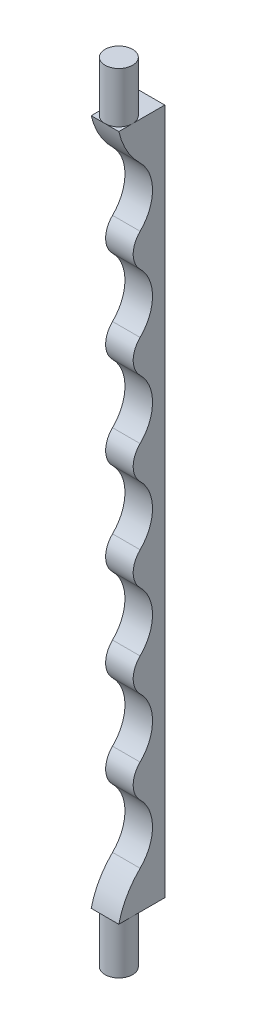
ISO-10303-21;
HEADER;
FILE_DESCRIPTION(('STEP AP214'),'2;1');
FILE_NAME('part.step','',(''),(''),'','','');
FILE_SCHEMA(('AUTOMOTIVE_DESIGN { 1 0 10303 214 1 1 1 1 }'));
ENDSEC;
DATA;
#1=APPLICATION_CONTEXT('core data for automotive mechanical design processes');
#2=APPLICATION_PROTOCOL_DEFINITION('international standard','automotive_design',2000,#1);
#3=PRODUCT_CONTEXT('',#1,'mechanical');
#4=PRODUCT('Part','Part','',(#3));
#5=PRODUCT_RELATED_PRODUCT_CATEGORY('part','',(#4));
#6=PRODUCT_DEFINITION_FORMATION('','',#4);
#7=PRODUCT_DEFINITION_CONTEXT('part definition',#1,'design');
#8=PRODUCT_DEFINITION('design','',#6,#7);
#9=PRODUCT_DEFINITION_SHAPE('','',#8);
#10=(LENGTH_UNIT() NAMED_UNIT(*) SI_UNIT(.MILLI.,.METRE.));
#11=(NAMED_UNIT(*) PLANE_ANGLE_UNIT() SI_UNIT($,.RADIAN.));
#12=(NAMED_UNIT(*) SI_UNIT($,.STERADIAN.) SOLID_ANGLE_UNIT());
#13=UNCERTAINTY_MEASURE_WITH_UNIT(LENGTH_MEASURE(1.E-05),#10,'distance_accuracy_value','');
#14=(GEOMETRIC_REPRESENTATION_CONTEXT(3) GLOBAL_UNCERTAINTY_ASSIGNED_CONTEXT((#13)) GLOBAL_UNIT_ASSIGNED_CONTEXT((#10,
#11,#12)) REPRESENTATION_CONTEXT('',''));
#15=CARTESIAN_POINT('',(0.,0.,0.));
#16=DIRECTION('',(0.,0.,1.));
#17=DIRECTION('',(1.,0.,0.));
#18=AXIS2_PLACEMENT_3D('',#15,#16,#17);
#19=CARTESIAN_POINT('',(9.,112.,-2.49999999999984));
#20=DIRECTION('',(0.,-1.,0.));
#21=DIRECTION('',(0.,0.,-1.));
#22=AXIS2_PLACEMENT_3D('',#19,#20,#21);
#23=PLANE('',#22);
#24=DIRECTION('',(0.,0.,1.));
#25=VECTOR('',#24,1.);
#26=CARTESIAN_POINT('',(9.,112.,-2.49999999999984));
#27=LINE('',#26,#25);
#28=CARTESIAN_POINT('',(9.,112.,-7.0000000000005));
#29=VERTEX_POINT('',#28);
#30=CARTESIAN_POINT('',(9.,112.,-2.49999999999984));
#31=VERTEX_POINT('',#30);
#32=EDGE_CURVE('E192',#29,#31,#27,.T.);
#33=ORIENTED_EDGE('',*,*,#32,.F.);
#34=CARTESIAN_POINT('',(4.5,112.,-7.0000000000005));
#35=DIRECTION('',(0.,-1.,0.));
#36=DIRECTION('',(0.,0.,-1.));
#37=AXIS2_PLACEMENT_3D('',#34,#35,#36);
#38=CIRCLE('',#37,4.5);
#39=CARTESIAN_POINT('',(4.5,112.,-2.5000000000005));
#40=VERTEX_POINT('',#39);
#41=EDGE_CURVE('E49',#29,#40,#38,.T.);
#42=ORIENTED_EDGE('',*,*,#41,.T.);
#43=DIRECTION('',(-1.,0.,0.));
#44=VECTOR('',#43,1.);
#45=CARTESIAN_POINT('',(9.,112.,-2.49999999999984));
#46=LINE('',#45,#44);
#47=EDGE_CURVE('E193',#31,#40,#46,.T.);
#48=ORIENTED_EDGE('',*,*,#47,.F.);
#49=EDGE_LOOP('',(#33,#42,#48));
#50=FACE_BOUND('',#49,.T.);
#51=ADVANCED_FACE('F39',(#50),#23,.F.);
#52=CARTESIAN_POINT('',(0.,112.,-2.49999999999984));
#53=VERTEX_POINT('',#52);
#54=EDGE_CURVE('E198',#40,#53,#46,.T.);
#55=ORIENTED_EDGE('',*,*,#54,.F.);
#56=CARTESIAN_POINT('',(0.,112.,-7.0000000000005));
#57=VERTEX_POINT('',#56);
#58=EDGE_CURVE('E11',#40,#57,#38,.T.);
#59=ORIENTED_EDGE('',*,*,#58,.T.);
#60=DIRECTION('',(0.,0.,1.));
#61=VECTOR('',#60,1.);
#62=CARTESIAN_POINT('',(0.,112.,-2.49999999999984));
#63=LINE('',#62,#61);
#64=EDGE_CURVE('E196',#57,#53,#63,.T.);
#65=ORIENTED_EDGE('',*,*,#64,.T.);
#66=EDGE_LOOP('',(#55,#59,#65));
#67=FACE_BOUND('',#66,.T.);
#68=ADVANCED_FACE('F197',(#67),#23,.F.);
#69=CARTESIAN_POINT('',(9.,-112.,-2.50000000000063));
#70=DIRECTION('',(0.,1.,0.));
#71=DIRECTION('',(0.,0.,1.));
#72=AXIS2_PLACEMENT_3D('',#69,#70,#71);
#73=PLANE('',#72);
#74=CARTESIAN_POINT('',(4.5,-112.,-7.0000000000005));
#75=DIRECTION('',(0.,-1.,0.));
#76=DIRECTION('',(0.,0.,-1.));
#77=AXIS2_PLACEMENT_3D('',#74,#75,#76);
#78=CIRCLE('',#77,4.5);
#79=CARTESIAN_POINT('',(9.,-112.,-7.0000000000005));
#80=VERTEX_POINT('',#79);
#81=CARTESIAN_POINT('',(4.5,-112.,-2.5000000000005));
#82=VERTEX_POINT('',#81);
#83=EDGE_CURVE('E254',#80,#82,#78,.T.);
#84=ORIENTED_EDGE('',*,*,#83,.F.);
#85=DIRECTION('',(0.,0.,-1.));
#86=VECTOR('',#85,1.);
#87=CARTESIAN_POINT('',(9.,-112.,-2.50000000000063));
#88=LINE('',#87,#86);
#89=CARTESIAN_POINT('',(9.,-112.,-2.5000000000005));
#90=VERTEX_POINT('',#89);
#91=EDGE_CURVE('E385',#90,#80,#88,.T.);
#92=ORIENTED_EDGE('',*,*,#91,.F.);
#93=DIRECTION('',(-1.,0.,0.));
#94=VECTOR('',#93,1.);
#95=CARTESIAN_POINT('',(9.,-112.,-2.5000000000005));
#96=LINE('',#95,#94);
#97=EDGE_CURVE('E216',#90,#82,#96,.T.);
#98=ORIENTED_EDGE('',*,*,#97,.T.);
#99=EDGE_LOOP('',(#84,#92,#98));
#100=FACE_BOUND('',#99,.T.);
#101=ADVANCED_FACE('F284',(#100),#73,.F.);
#102=CARTESIAN_POINT('',(0.,-112.,-7.0000000000005));
#103=VERTEX_POINT('',#102);
#104=EDGE_CURVE('E64',#82,#103,#78,.T.);
#105=ORIENTED_EDGE('',*,*,#104,.F.);
#106=CARTESIAN_POINT('',(0.,-112.,-2.5000000000005));
#107=VERTEX_POINT('',#106);
#108=EDGE_CURVE('E214',#82,#107,#96,.T.);
#109=ORIENTED_EDGE('',*,*,#108,.T.);
#110=DIRECTION('',(0.,0.,-1.));
#111=VECTOR('',#110,1.);
#112=CARTESIAN_POINT('',(0.,-112.,-2.50000000000063));
#113=LINE('',#112,#111);
#114=EDGE_CURVE('E372',#107,#103,#113,.T.);
#115=ORIENTED_EDGE('',*,*,#114,.T.);
#116=EDGE_LOOP('',(#105,#109,#115));
#117=FACE_BOUND('',#116,.T.);
#118=ADVANCED_FACE('F427',(#117),#73,.F.);
#119=CARTESIAN_POINT('',(9.,45.,-14.6969384566991));
#120=DIRECTION('',(-1.,0.,0.));
#121=DIRECTION('',(0.,0.,1.));
#122=AXIS2_PLACEMENT_3D('',#119,#120,#121);
#123=CYLINDRICAL_SURFACE('',#122,7.5);
#124=CARTESIAN_POINT('',(0.,45.,-14.6969384566991));
#125=DIRECTION('',(1.,0.,0.));
#126=DIRECTION('',(0.,0.,-1.));
#127=AXIS2_PLACEMENT_3D('',#124,#125,#126);
#128=CIRCLE('',#127,7.5);
#129=CARTESIAN_POINT('',(0.,50.3571428571428,-9.44803186502083));
#130=VERTEX_POINT('',#129);
#131=CARTESIAN_POINT('',(0.,39.6428571428571,-9.44803186502083));
#132=VERTEX_POINT('',#131);
#133=EDGE_CURVE('E263',#130,#132,#128,.T.);
#134=ORIENTED_EDGE('',*,*,#133,.T.);
#135=DIRECTION('',(-1.,0.,0.));
#136=VECTOR('',#135,1.);
#137=CARTESIAN_POINT('',(9.,39.6428571428571,-9.44803186502083));
#138=LINE('',#137,#136);
#139=CARTESIAN_POINT('',(9.,39.6428571428571,-9.44803186502083));
#140=VERTEX_POINT('',#139);
#141=EDGE_CURVE('E43',#140,#132,#138,.T.);
#142=ORIENTED_EDGE('',*,*,#141,.F.);
#143=CARTESIAN_POINT('',(9.,45.,-14.6969384566991));
#144=DIRECTION('',(1.,0.,0.));
#145=DIRECTION('',(0.,0.,-1.));
#146=AXIS2_PLACEMENT_3D('',#143,#144,#145);
#147=CIRCLE('',#146,7.5);
#148=CARTESIAN_POINT('',(9.,50.3571428571428,-9.44803186502083));
#149=VERTEX_POINT('',#148);
#150=EDGE_CURVE('E320',#149,#140,#147,.T.);
#151=ORIENTED_EDGE('',*,*,#150,.F.);
#152=DIRECTION('',(-1.,0.,0.));
#153=VECTOR('',#152,1.);
#154=CARTESIAN_POINT('',(9.,50.3571428571428,-9.44803186502083));
#155=LINE('',#154,#153);
#156=EDGE_CURVE('E318',#149,#130,#155,.T.);
#157=ORIENTED_EDGE('',*,*,#156,.T.);
#158=EDGE_LOOP('',(#134,#142,#151,#157));
#159=FACE_BOUND('',#158,.T.);
#160=ADVANCED_FACE('F41',(#159),#123,.T.);
#161=CARTESIAN_POINT('',(9.,30.,0.));
#162=DIRECTION('',(-1.,0.,0.));
#163=DIRECTION('',(0.,0.,1.));
#164=AXIS2_PLACEMENT_3D('',#161,#162,#163);
#165=CYLINDRICAL_SURFACE('',#164,13.5);
#166=CARTESIAN_POINT('',(0.,30.,0.));
#167=DIRECTION('',(-1.,0.,0.));
#168=DIRECTION('',(0.,0.,-1.));
#169=AXIS2_PLACEMENT_3D('',#166,#167,#168);
#170=CIRCLE('',#169,13.5);
#171=CARTESIAN_POINT('',(0.,20.3571428571429,-9.44803186502082));
#172=VERTEX_POINT('',#171);
#173=EDGE_CURVE('E351',#132,#172,#170,.T.);
#174=ORIENTED_EDGE('',*,*,#173,.T.);
#175=DIRECTION('',(-1.,0.,0.));
#176=VECTOR('',#175,1.);
#177=CARTESIAN_POINT('',(9.,20.3571428571429,-9.44803186502082));
#178=LINE('',#177,#176);
#179=CARTESIAN_POINT('',(9.,20.3571428571429,-9.44803186502082));
#180=VERTEX_POINT('',#179);
#181=EDGE_CURVE('E245',#180,#172,#178,.T.);
#182=ORIENTED_EDGE('',*,*,#181,.F.);
#183=CARTESIAN_POINT('',(9.,30.,0.));
#184=DIRECTION('',(-1.,0.,0.));
#185=DIRECTION('',(0.,0.,-1.));
#186=AXIS2_PLACEMENT_3D('',#183,#184,#185);
#187=CIRCLE('',#186,13.5);
#188=EDGE_CURVE('E613',#140,#180,#187,.T.);
#189=ORIENTED_EDGE('',*,*,#188,.F.);
#190=ORIENTED_EDGE('',*,*,#141,.T.);
#191=EDGE_LOOP('',(#174,#182,#189,#190));
#192=FACE_BOUND('',#191,.T.);
#193=ADVANCED_FACE('F585',(#192),#165,.F.);
#194=CARTESIAN_POINT('',(9.,15.,-14.6969384566991));
#195=DIRECTION('',(-1.,0.,0.));
#196=DIRECTION('',(0.,0.,1.));
#197=AXIS2_PLACEMENT_3D('',#194,#195,#196);
#198=CYLINDRICAL_SURFACE('',#197,7.5);
#199=CARTESIAN_POINT('',(0.,15.,-14.6969384566991));
#200=DIRECTION('',(1.,0.,0.));
#201=DIRECTION('',(0.,0.,-1.));
#202=AXIS2_PLACEMENT_3D('',#199,#200,#201);
#203=CIRCLE('',#202,7.5);
#204=CARTESIAN_POINT('',(0.,9.64285714285714,-9.44803186502083));
#205=VERTEX_POINT('',#204);
#206=EDGE_CURVE('E352',#172,#205,#203,.T.);
#207=ORIENTED_EDGE('',*,*,#206,.T.);
#208=DIRECTION('',(-1.,0.,0.));
#209=VECTOR('',#208,1.);
#210=CARTESIAN_POINT('',(9.,9.64285714285714,-9.44803186502083));
#211=LINE('',#210,#209);
#212=CARTESIAN_POINT('',(9.,9.64285714285714,-9.44803186502083));
#213=VERTEX_POINT('',#212);
#214=EDGE_CURVE('E238',#213,#205,#211,.T.);
#215=ORIENTED_EDGE('',*,*,#214,.F.);
#216=CARTESIAN_POINT('',(9.,15.,-14.6969384566991));
#217=DIRECTION('',(1.,0.,0.));
#218=DIRECTION('',(0.,0.,-1.));
#219=AXIS2_PLACEMENT_3D('',#216,#217,#218);
#220=CIRCLE('',#219,7.5);
#221=EDGE_CURVE('E611',#180,#213,#220,.T.);
#222=ORIENTED_EDGE('',*,*,#221,.F.);
#223=ORIENTED_EDGE('',*,*,#181,.T.);
#224=EDGE_LOOP('',(#207,#215,#222,#223));
#225=FACE_BOUND('',#224,.T.);
#226=ADVANCED_FACE('F572',(#225),#198,.T.);
#227=CARTESIAN_POINT('',(9.,0.,0.));
#228=DIRECTION('',(-1.,0.,0.));
#229=DIRECTION('',(0.,0.,1.));
#230=AXIS2_PLACEMENT_3D('',#227,#228,#229);
#231=CYLINDRICAL_SURFACE('',#230,13.5);
#232=CARTESIAN_POINT('',(0.,0.,0.));
#233=DIRECTION('',(-1.,0.,0.));
#234=DIRECTION('',(0.,0.,-1.));
#235=AXIS2_PLACEMENT_3D('',#232,#233,#234);
#236=CIRCLE('',#235,13.5);
#237=CARTESIAN_POINT('',(0.,-9.64285714285708,-9.44803186502089));
#238=VERTEX_POINT('',#237);
#239=EDGE_CURVE('E359',#205,#238,#236,.T.);
#240=ORIENTED_EDGE('',*,*,#239,.T.);
#241=DIRECTION('',(-1.,0.,0.));
#242=VECTOR('',#241,1.);
#243=CARTESIAN_POINT('',(9.,-9.64285714285708,-9.44803186502089));
#244=LINE('',#243,#242);
#245=CARTESIAN_POINT('',(9.,-9.64285714285708,-9.44803186502089));
#246=VERTEX_POINT('',#245);
#247=EDGE_CURVE('E240',#246,#238,#244,.T.);
#248=ORIENTED_EDGE('',*,*,#247,.F.);
#249=CARTESIAN_POINT('',(9.,0.,0.));
#250=DIRECTION('',(-1.,0.,0.));
#251=DIRECTION('',(0.,0.,-1.));
#252=AXIS2_PLACEMENT_3D('',#249,#250,#251);
#253=CIRCLE('',#252,13.5);
#254=EDGE_CURVE('E612',#213,#246,#253,.T.);
#255=ORIENTED_EDGE('',*,*,#254,.F.);
#256=ORIENTED_EDGE('',*,*,#214,.T.);
#257=EDGE_LOOP('',(#240,#248,#255,#256));
#258=FACE_BOUND('',#257,.T.);
#259=ADVANCED_FACE('F567',(#258),#231,.F.);
#260=CARTESIAN_POINT('',(9.,-14.9999999999999,-14.6969384566992));
#261=DIRECTION('',(-1.,0.,0.));
#262=DIRECTION('',(0.,0.,1.));
#263=AXIS2_PLACEMENT_3D('',#260,#261,#262);
#264=CYLINDRICAL_SURFACE('',#263,7.5);
#265=CARTESIAN_POINT('',(0.,-14.9999999999999,-14.6969384566992));
#266=DIRECTION('',(1.,0.,0.));
#267=DIRECTION('',(0.,0.,-1.));
#268=AXIS2_PLACEMENT_3D('',#265,#266,#267);
#269=CIRCLE('',#268,7.5);
#270=CARTESIAN_POINT('',(0.,-20.3571428571428,-9.44803186502097));
#271=VERTEX_POINT('',#270);
#272=EDGE_CURVE('E360',#238,#271,#269,.T.);
#273=ORIENTED_EDGE('',*,*,#272,.T.);
#274=DIRECTION('',(-1.,0.,0.));
#275=VECTOR('',#274,1.);
#276=CARTESIAN_POINT('',(9.,-20.3571428571428,-9.44803186502097));
#277=LINE('',#276,#275);
#278=CARTESIAN_POINT('',(9.,-20.3571428571428,-9.44803186502097));
#279=VERTEX_POINT('',#278);
#280=EDGE_CURVE('E235',#279,#271,#277,.T.);
#281=ORIENTED_EDGE('',*,*,#280,.F.);
#282=CARTESIAN_POINT('',(9.,-14.9999999999999,-14.6969384566992));
#283=DIRECTION('',(1.,0.,0.));
#284=DIRECTION('',(0.,0.,-1.));
#285=AXIS2_PLACEMENT_3D('',#282,#283,#284);
#286=CIRCLE('',#285,7.5);
#287=EDGE_CURVE('E619',#246,#279,#286,.T.);
#288=ORIENTED_EDGE('',*,*,#287,.F.);
#289=ORIENTED_EDGE('',*,*,#247,.T.);
#290=EDGE_LOOP('',(#273,#281,#288,#289));
#291=FACE_BOUND('',#290,.T.);
#292=ADVANCED_FACE('F560',(#291),#264,.T.);
#293=CARTESIAN_POINT('',(9.,-30.,-2.09488880330588E-13));
#294=DIRECTION('',(-1.,0.,0.));
#295=DIRECTION('',(0.,0.,1.));
#296=AXIS2_PLACEMENT_3D('',#293,#294,#295);
#297=CYLINDRICAL_SURFACE('',#296,13.5);
#298=CARTESIAN_POINT('',(0.,-30.,-2.09488880330588E-13));
#299=DIRECTION('',(-1.,0.,0.));
#300=DIRECTION('',(0.,0.,-1.));
#301=AXIS2_PLACEMENT_3D('',#298,#299,#300);
#302=CIRCLE('',#301,13.5);
#303=CARTESIAN_POINT('',(0.,-39.6428571428571,-9.4480318650211));
#304=VERTEX_POINT('',#303);
#305=EDGE_CURVE('E363',#271,#304,#302,.T.);
#306=ORIENTED_EDGE('',*,*,#305,.T.);
#307=DIRECTION('',(-1.,0.,0.));
#308=VECTOR('',#307,1.);
#309=CARTESIAN_POINT('',(9.,-39.6428571428571,-9.4480318650211));
#310=LINE('',#309,#308);
#311=CARTESIAN_POINT('',(9.,-39.6428571428571,-9.4480318650211));
#312=VERTEX_POINT('',#311);
#313=EDGE_CURVE('E233',#312,#304,#310,.T.);
#314=ORIENTED_EDGE('',*,*,#313,.F.);
#315=CARTESIAN_POINT('',(9.,-30.,-2.09488880330588E-13));
#316=DIRECTION('',(-1.,0.,0.));
#317=DIRECTION('',(0.,0.,-1.));
#318=AXIS2_PLACEMENT_3D('',#315,#316,#317);
#319=CIRCLE('',#318,13.5);
#320=EDGE_CURVE('E625',#279,#312,#319,.T.);
#321=ORIENTED_EDGE('',*,*,#320,.F.);
#322=ORIENTED_EDGE('',*,*,#280,.T.);
#323=EDGE_LOOP('',(#306,#314,#321,#322));
#324=FACE_BOUND('',#323,.T.);
#325=ADVANCED_FACE('F547',(#324),#297,.F.);
#326=CARTESIAN_POINT('',(9.,-44.9999999999999,-14.6969384566994));
#327=DIRECTION('',(-1.,0.,0.));
#328=DIRECTION('',(0.,0.,1.));
#329=AXIS2_PLACEMENT_3D('',#326,#327,#328);
#330=CYLINDRICAL_SURFACE('',#329,7.5);
#331=CARTESIAN_POINT('',(0.,-44.9999999999999,-14.6969384566994));
#332=DIRECTION('',(1.,0.,0.));
#333=DIRECTION('',(0.,0.,-1.));
#334=AXIS2_PLACEMENT_3D('',#331,#332,#333);
#335=CIRCLE('',#334,7.5);
#336=CARTESIAN_POINT('',(0.,-50.3571428571428,-9.44803186502118));
#337=VERTEX_POINT('',#336);
#338=EDGE_CURVE('E361',#304,#337,#335,.T.);
#339=ORIENTED_EDGE('',*,*,#338,.T.);
#340=DIRECTION('',(-1.,0.,0.));
#341=VECTOR('',#340,1.);
#342=CARTESIAN_POINT('',(9.,-50.3571428571428,-9.44803186502118));
#343=LINE('',#342,#341);
#344=CARTESIAN_POINT('',(9.,-50.3571428571428,-9.44803186502118));
#345=VERTEX_POINT('',#344);
#346=EDGE_CURVE('E226',#345,#337,#343,.T.);
#347=ORIENTED_EDGE('',*,*,#346,.F.);
#348=CARTESIAN_POINT('',(9.,-44.9999999999999,-14.6969384566994));
#349=DIRECTION('',(1.,0.,0.));
#350=DIRECTION('',(0.,0.,-1.));
#351=AXIS2_PLACEMENT_3D('',#348,#349,#350);
#352=CIRCLE('',#351,7.5);
#353=EDGE_CURVE('E624',#312,#345,#352,.T.);
#354=ORIENTED_EDGE('',*,*,#353,.F.);
#355=ORIENTED_EDGE('',*,*,#313,.T.);
#356=EDGE_LOOP('',(#339,#347,#354,#355));
#357=FACE_BOUND('',#356,.T.);
#358=ADVANCED_FACE('F537',(#357),#330,.T.);
#359=CARTESIAN_POINT('',(9.,-60.,-4.18977760661176E-13));
#360=DIRECTION('',(-1.,0.,0.));
#361=DIRECTION('',(0.,0.,1.));
#362=AXIS2_PLACEMENT_3D('',#359,#360,#361);
#363=CYLINDRICAL_SURFACE('',#362,13.5);
#364=CARTESIAN_POINT('',(0.,-60.,-4.18977760661176E-13));
#365=DIRECTION('',(-1.,0.,0.));
#366=DIRECTION('',(0.,0.,-1.));
#367=AXIS2_PLACEMENT_3D('',#364,#365,#366);
#368=CIRCLE('',#367,13.5);
#369=CARTESIAN_POINT('',(0.,-69.6428571428571,-9.44803186502131));
#370=VERTEX_POINT('',#369);
#371=EDGE_CURVE('E364',#337,#370,#368,.T.);
#372=ORIENTED_EDGE('',*,*,#371,.T.);
#373=DIRECTION('',(-1.,0.,0.));
#374=VECTOR('',#373,1.);
#375=CARTESIAN_POINT('',(9.,-69.6428571428571,-9.44803186502131));
#376=LINE('',#375,#374);
#377=CARTESIAN_POINT('',(9.,-69.6428571428571,-9.44803186502131));
#378=VERTEX_POINT('',#377);
#379=EDGE_CURVE('E223',#378,#370,#376,.T.);
#380=ORIENTED_EDGE('',*,*,#379,.F.);
#381=CARTESIAN_POINT('',(9.,-60.,-4.18977760661176E-13));
#382=DIRECTION('',(-1.,0.,0.));
#383=DIRECTION('',(0.,0.,-1.));
#384=AXIS2_PLACEMENT_3D('',#381,#382,#383);
#385=CIRCLE('',#384,13.5);
#386=EDGE_CURVE('E628',#345,#378,#385,.T.);
#387=ORIENTED_EDGE('',*,*,#386,.F.);
#388=ORIENTED_EDGE('',*,*,#346,.T.);
#389=EDGE_LOOP('',(#372,#380,#387,#388));
#390=FACE_BOUND('',#389,.T.);
#391=ADVANCED_FACE('F529',(#390),#363,.F.);
#392=CARTESIAN_POINT('',(9.,-74.9999999999999,-14.6969384566996));
#393=DIRECTION('',(-1.,0.,0.));
#394=DIRECTION('',(0.,0.,1.));
#395=AXIS2_PLACEMENT_3D('',#392,#393,#394);
#396=CYLINDRICAL_SURFACE('',#395,7.49999999999996);
#397=CARTESIAN_POINT('',(0.,-74.9999999999999,-14.6969384566996));
#398=DIRECTION('',(1.,0.,0.));
#399=DIRECTION('',(0.,0.,-1.));
#400=AXIS2_PLACEMENT_3D('',#397,#398,#399);
#401=CIRCLE('',#400,7.49999999999996);
#402=CARTESIAN_POINT('',(0.,-80.3571428571426,-9.44803186502128));
#403=VERTEX_POINT('',#402);
#404=EDGE_CURVE('E370',#370,#403,#401,.T.);
#405=ORIENTED_EDGE('',*,*,#404,.T.);
#406=DIRECTION('',(-1.,0.,0.));
#407=VECTOR('',#406,1.);
#408=CARTESIAN_POINT('',(9.,-80.3571428571426,-9.44803186502128));
#409=LINE('',#408,#407);
#410=CARTESIAN_POINT('',(9.,-80.3571428571426,-9.44803186502128));
#411=VERTEX_POINT('',#410);
#412=EDGE_CURVE('E225',#411,#403,#409,.T.);
#413=ORIENTED_EDGE('',*,*,#412,.F.);
#414=CARTESIAN_POINT('',(9.,-74.9999999999999,-14.6969384566996));
#415=DIRECTION('',(1.,0.,0.));
#416=DIRECTION('',(0.,0.,-1.));
#417=AXIS2_PLACEMENT_3D('',#414,#415,#416);
#418=CIRCLE('',#417,7.49999999999996);
#419=EDGE_CURVE('E626',#378,#411,#418,.T.);
#420=ORIENTED_EDGE('',*,*,#419,.F.);
#421=ORIENTED_EDGE('',*,*,#379,.T.);
#422=EDGE_LOOP('',(#405,#413,#420,#421));
#423=FACE_BOUND('',#422,.T.);
#424=ADVANCED_FACE('F523',(#423),#396,.T.);
#425=CARTESIAN_POINT('',(9.,-89.9999999999998,-4.85806818960967E-13));
#426=DIRECTION('',(-1.,0.,0.));
#427=DIRECTION('',(0.,0.,1.));
#428=AXIS2_PLACEMENT_3D('',#425,#426,#427);
#429=CYLINDRICAL_SURFACE('',#428,13.5);
#430=CARTESIAN_POINT('',(0.,-89.9999999999998,-4.85806818960967E-13));
#431=DIRECTION('',(-1.,0.,0.));
#432=DIRECTION('',(0.,0.,-1.));
#433=AXIS2_PLACEMENT_3D('',#430,#431,#432);
#434=CIRCLE('',#433,13.5);
#435=CARTESIAN_POINT('',(0.,-99.6428571428569,-9.44803186502131));
#436=VERTEX_POINT('',#435);
#437=EDGE_CURVE('E369',#403,#436,#434,.T.);
#438=ORIENTED_EDGE('',*,*,#437,.T.);
#439=DIRECTION('',(-1.,0.,0.));
#440=VECTOR('',#439,1.);
#441=CARTESIAN_POINT('',(9.,-99.6428571428569,-9.44803186502131));
#442=LINE('',#441,#440);
#443=CARTESIAN_POINT('',(9.,-99.6428571428569,-9.44803186502131));
#444=VERTEX_POINT('',#443);
#445=EDGE_CURVE('E218',#444,#436,#442,.T.);
#446=ORIENTED_EDGE('',*,*,#445,.F.);
#447=CARTESIAN_POINT('',(9.,-89.9999999999998,-4.85806818960967E-13));
#448=DIRECTION('',(-1.,0.,0.));
#449=DIRECTION('',(0.,0.,-1.));
#450=AXIS2_PLACEMENT_3D('',#447,#448,#449);
#451=CIRCLE('',#450,13.5);
#452=EDGE_CURVE('E627',#411,#444,#451,.T.);
#453=ORIENTED_EDGE('',*,*,#452,.F.);
#454=ORIENTED_EDGE('',*,*,#412,.T.);
#455=EDGE_LOOP('',(#438,#446,#453,#454));
#456=FACE_BOUND('',#455,.T.);
#457=ADVANCED_FACE('F448',(#456),#429,.F.);
#458=CARTESIAN_POINT('',(9.,-117.750299061326,-27.1896291639541));
#459=DIRECTION('',(-1.,0.,0.));
#460=DIRECTION('',(0.,0.,1.));
#461=AXIS2_PLACEMENT_3D('',#458,#459,#460);
#462=CYLINDRICAL_SURFACE('',#461,25.3504186858569);
#463=CARTESIAN_POINT('',(0.,-117.750299061326,-27.1896291639541));
#464=DIRECTION('',(1.,0.,0.));
#465=DIRECTION('',(0.,0.,-1.));
#466=AXIS2_PLACEMENT_3D('',#463,#464,#465);
#467=CIRCLE('',#466,25.3504186858569);
#468=EDGE_CURVE('E371',#436,#107,#467,.T.);
#469=ORIENTED_EDGE('',*,*,#468,.T.);
#470=ORIENTED_EDGE('',*,*,#108,.F.);
#471=ORIENTED_EDGE('',*,*,#97,.F.);
#472=CARTESIAN_POINT('',(9.,-117.750299061326,-27.1896291639541));
#473=DIRECTION('',(1.,0.,0.));
#474=DIRECTION('',(0.,0.,-1.));
#475=AXIS2_PLACEMENT_3D('',#472,#473,#474);
#476=CIRCLE('',#475,25.3504186858569);
#477=EDGE_CURVE('E633',#444,#90,#476,.T.);
#478=ORIENTED_EDGE('',*,*,#477,.F.);
#479=ORIENTED_EDGE('',*,*,#445,.T.);
#480=EDGE_LOOP('',(#469,#470,#471,#478,#479));
#481=FACE_BOUND('',#480,.T.);
#482=ADVANCED_FACE('F445',(#481),#462,.T.);
#483=EDGE_CURVE('E250',#103,#80,#78,.T.);
#484=ORIENTED_EDGE('',*,*,#483,.F.);
#485=CARTESIAN_POINT('',(0.,-112.,-17.4999999999997));
#486=VERTEX_POINT('',#485);
#487=EDGE_CURVE('E373',#103,#486,#113,.T.);
#488=ORIENTED_EDGE('',*,*,#487,.T.);
#489=DIRECTION('',(-1.,0.,0.));
#490=VECTOR('',#489,1.);
#491=CARTESIAN_POINT('',(9.,-112.,-17.4999999999997));
#492=LINE('',#491,#490);
#493=CARTESIAN_POINT('',(9.,-112.,-17.4999999999997));
#494=VERTEX_POINT('',#493);
#495=EDGE_CURVE('E208',#494,#486,#492,.T.);
#496=ORIENTED_EDGE('',*,*,#495,.F.);
#497=EDGE_CURVE('E387',#80,#494,#88,.T.);
#498=ORIENTED_EDGE('',*,*,#497,.F.);
#499=EDGE_LOOP('',(#484,#488,#496,#498));
#500=FACE_BOUND('',#499,.T.);
#501=ADVANCED_FACE('F293',(#500),#73,.F.);
#502=CARTESIAN_POINT('',(9.,-112.,-17.4999999999997));
#503=DIRECTION('',(0.,0.,1.));
#504=DIRECTION('',(1.,0.,0.));
#505=AXIS2_PLACEMENT_3D('',#502,#503,#504);
#506=PLANE('',#505);
#507=DIRECTION('',(0.,1.,0.));
#508=VECTOR('',#507,1.);
#509=CARTESIAN_POINT('',(0.,-112.,-17.4999999999997));
#510=LINE('',#509,#508);
#511=CARTESIAN_POINT('',(0.,112.,-17.4999999999997));
#512=VERTEX_POINT('',#511);
#513=EDGE_CURVE('E306',#486,#512,#510,.T.);
#514=ORIENTED_EDGE('',*,*,#513,.T.);
#515=DIRECTION('',(-1.,0.,0.));
#516=VECTOR('',#515,1.);
#517=CARTESIAN_POINT('',(9.,112.,-17.4999999999997));
#518=LINE('',#517,#516);
#519=CARTESIAN_POINT('',(9.,112.,-17.4999999999997));
#520=VERTEX_POINT('',#519);
#521=EDGE_CURVE('E206',#520,#512,#518,.T.);
#522=ORIENTED_EDGE('',*,*,#521,.F.);
#523=DIRECTION('',(0.,1.,0.));
#524=VECTOR('',#523,1.);
#525=CARTESIAN_POINT('',(9.,-112.,-17.4999999999997));
#526=LINE('',#525,#524);
#527=EDGE_CURVE('E381',#494,#520,#526,.T.);
#528=ORIENTED_EDGE('',*,*,#527,.F.);
#529=ORIENTED_EDGE('',*,*,#495,.T.);
#530=EDGE_LOOP('',(#514,#522,#528,#529));
#531=FACE_BOUND('',#530,.T.);
#532=ADVANCED_FACE('F287',(#531),#506,.F.);
#533=EDGE_CURVE('E299',#512,#57,#63,.T.);
#534=ORIENTED_EDGE('',*,*,#533,.T.);
#535=EDGE_CURVE('E48',#57,#29,#38,.T.);
#536=ORIENTED_EDGE('',*,*,#535,.T.);
#537=EDGE_CURVE('E383',#520,#29,#27,.T.);
#538=ORIENTED_EDGE('',*,*,#537,.F.);
#539=ORIENTED_EDGE('',*,*,#521,.T.);
#540=EDGE_LOOP('',(#534,#536,#538,#539));
#541=FACE_BOUND('',#540,.T.);
#542=ADVANCED_FACE('F276',(#541),#23,.F.);
#543=CARTESIAN_POINT('',(9.,117.750299061328,-27.1896291639552));
#544=DIRECTION('',(-1.,0.,0.));
#545=DIRECTION('',(0.,0.,1.));
#546=AXIS2_PLACEMENT_3D('',#543,#544,#545);
#547=CYLINDRICAL_SURFACE('',#546,25.3504186858589);
#548=CARTESIAN_POINT('',(0.,117.750299061328,-27.1896291639552));
#549=DIRECTION('',(1.,0.,0.));
#550=DIRECTION('',(0.,0.,1.));
#551=AXIS2_PLACEMENT_3D('',#548,#549,#550);
#552=CIRCLE('',#551,25.3504186858589);
#553=CARTESIAN_POINT('',(0.,99.6428571428571,-9.44803186502083));
#554=VERTEX_POINT('',#553);
#555=EDGE_CURVE('E305',#53,#554,#552,.T.);
#556=ORIENTED_EDGE('',*,*,#555,.T.);
#557=DIRECTION('',(-1.,0.,0.));
#558=VECTOR('',#557,1.);
#559=CARTESIAN_POINT('',(9.,99.6428571428571,-9.44803186502083));
#560=LINE('',#559,#558);
#561=CARTESIAN_POINT('',(9.,99.6428571428571,-9.44803186502083));
#562=VERTEX_POINT('',#561);
#563=EDGE_CURVE('E203',#562,#554,#560,.T.);
#564=ORIENTED_EDGE('',*,*,#563,.F.);
#565=CARTESIAN_POINT('',(9.,117.750299061328,-27.1896291639552));
#566=DIRECTION('',(1.,0.,0.));
#567=DIRECTION('',(0.,0.,1.));
#568=AXIS2_PLACEMENT_3D('',#565,#566,#567);
#569=CIRCLE('',#568,25.3504186858589);
#570=EDGE_CURVE('E202',#31,#562,#569,.T.);
#571=ORIENTED_EDGE('',*,*,#570,.F.);
#572=ORIENTED_EDGE('',*,*,#47,.T.);
#573=ORIENTED_EDGE('',*,*,#54,.T.);
#574=EDGE_LOOP('',(#556,#564,#571,#572,#573));
#575=FACE_BOUND('',#574,.T.);
#576=ADVANCED_FACE('F201',(#575),#547,.T.);
#577=CARTESIAN_POINT('',(9.,90.,0.));
#578=DIRECTION('',(-1.,0.,0.));
#579=DIRECTION('',(0.,0.,1.));
#580=AXIS2_PLACEMENT_3D('',#577,#578,#579);
#581=CYLINDRICAL_SURFACE('',#580,13.5);
#582=CARTESIAN_POINT('',(0.,90.,0.));
#583=DIRECTION('',(-1.,0.,0.));
#584=DIRECTION('',(0.,0.,-1.));
#585=AXIS2_PLACEMENT_3D('',#582,#583,#584);
#586=CIRCLE('',#585,13.5);
#587=CARTESIAN_POINT('',(0.,80.3571428571428,-9.44803186502083));
#588=VERTEX_POINT('',#587);
#589=EDGE_CURVE('E308',#554,#588,#586,.T.);
#590=ORIENTED_EDGE('',*,*,#589,.T.);
#591=DIRECTION('',(-1.,0.,0.));
#592=VECTOR('',#591,1.);
#593=CARTESIAN_POINT('',(9.,80.3571428571428,-9.44803186502083));
#594=LINE('',#593,#592);
#595=CARTESIAN_POINT('',(9.,80.3571428571428,-9.44803186502083));
#596=VERTEX_POINT('',#595);
#597=EDGE_CURVE('E322',#596,#588,#594,.T.);
#598=ORIENTED_EDGE('',*,*,#597,.F.);
#599=CARTESIAN_POINT('',(9.,90.,0.));
#600=DIRECTION('',(-1.,0.,0.));
#601=DIRECTION('',(0.,0.,-1.));
#602=AXIS2_PLACEMENT_3D('',#599,#600,#601);
#603=CIRCLE('',#602,13.5);
#604=EDGE_CURVE('E331',#562,#596,#603,.T.);
#605=ORIENTED_EDGE('',*,*,#604,.F.);
#606=ORIENTED_EDGE('',*,*,#563,.T.);
#607=EDGE_LOOP('',(#590,#598,#605,#606));
#608=FACE_BOUND('',#607,.T.);
#609=ADVANCED_FACE('F291',(#608),#581,.F.);
#610=CARTESIAN_POINT('',(9.,75.,-14.6969384566991));
#611=DIRECTION('',(-1.,0.,0.));
#612=DIRECTION('',(0.,0.,1.));
#613=AXIS2_PLACEMENT_3D('',#610,#611,#612);
#614=CYLINDRICAL_SURFACE('',#613,7.5);
#615=CARTESIAN_POINT('',(0.,75.,-14.6969384566991));
#616=DIRECTION('',(1.,0.,0.));
#617=DIRECTION('',(0.,0.,-1.));
#618=AXIS2_PLACEMENT_3D('',#615,#616,#617);
#619=CIRCLE('',#618,7.5);
#620=CARTESIAN_POINT('',(0.,69.6428571428571,-9.44803186502083));
#621=VERTEX_POINT('',#620);
#622=EDGE_CURVE('E311',#588,#621,#619,.T.);
#623=ORIENTED_EDGE('',*,*,#622,.T.);
#624=DIRECTION('',(-1.,0.,0.));
#625=VECTOR('',#624,1.);
#626=CARTESIAN_POINT('',(9.,69.6428571428571,-9.44803186502083));
#627=LINE('',#626,#625);
#628=CARTESIAN_POINT('',(9.,69.6428571428571,-9.44803186502083));
#629=VERTEX_POINT('',#628);
#630=EDGE_CURVE('E321',#629,#621,#627,.T.);
#631=ORIENTED_EDGE('',*,*,#630,.F.);
#632=CARTESIAN_POINT('',(9.,75.,-14.6969384566991));
#633=DIRECTION('',(1.,0.,0.));
#634=DIRECTION('',(0.,0.,-1.));
#635=AXIS2_PLACEMENT_3D('',#632,#633,#634);
#636=CIRCLE('',#635,7.5);
#637=EDGE_CURVE('E350',#596,#629,#636,.T.);
#638=ORIENTED_EDGE('',*,*,#637,.F.);
#639=ORIENTED_EDGE('',*,*,#597,.T.);
#640=EDGE_LOOP('',(#623,#631,#638,#639));
#641=FACE_BOUND('',#640,.T.);
#642=ADVANCED_FACE('F339',(#641),#614,.T.);
#643=CARTESIAN_POINT('',(9.,60.,0.));
#644=DIRECTION('',(-1.,0.,0.));
#645=DIRECTION('',(0.,0.,1.));
#646=AXIS2_PLACEMENT_3D('',#643,#644,#645);
#647=CYLINDRICAL_SURFACE('',#646,13.5);
#648=CARTESIAN_POINT('',(0.,60.,0.));
#649=DIRECTION('',(-1.,0.,0.));
#650=DIRECTION('',(0.,0.,-1.));
#651=AXIS2_PLACEMENT_3D('',#648,#649,#650);
#652=CIRCLE('',#651,13.5);
#653=EDGE_CURVE('E312',#621,#130,#652,.T.);
#654=ORIENTED_EDGE('',*,*,#653,.T.);
#655=ORIENTED_EDGE('',*,*,#156,.F.);
#656=CARTESIAN_POINT('',(9.,60.,0.));
#657=DIRECTION('',(-1.,0.,0.));
#658=DIRECTION('',(0.,0.,-1.));
#659=AXIS2_PLACEMENT_3D('',#656,#657,#658);
#660=CIRCLE('',#659,13.5);
#661=EDGE_CURVE('E325',#629,#149,#660,.T.);
#662=ORIENTED_EDGE('',*,*,#661,.F.);
#663=ORIENTED_EDGE('',*,*,#630,.T.);
#664=EDGE_LOOP('',(#654,#655,#662,#663));
#665=FACE_BOUND('',#664,.T.);
#666=ADVANCED_FACE('F344',(#665),#647,.F.);
#667=CARTESIAN_POINT('',(9.,45.,-14.6969384566991));
#668=DIRECTION('',(1.,0.,0.));
#669=DIRECTION('',(0.,0.,-1.));
#670=AXIS2_PLACEMENT_3D('',#667,#668,#669);
#671=PLANE('',#670);
#672=ORIENTED_EDGE('',*,*,#150,.T.);
#673=ORIENTED_EDGE('',*,*,#188,.T.);
#674=ORIENTED_EDGE('',*,*,#221,.T.);
#675=ORIENTED_EDGE('',*,*,#254,.T.);
#676=ORIENTED_EDGE('',*,*,#287,.T.);
#677=ORIENTED_EDGE('',*,*,#320,.T.);
#678=ORIENTED_EDGE('',*,*,#353,.T.);
#679=ORIENTED_EDGE('',*,*,#386,.T.);
#680=ORIENTED_EDGE('',*,*,#419,.T.);
#681=ORIENTED_EDGE('',*,*,#452,.T.);
#682=ORIENTED_EDGE('',*,*,#477,.T.);
#683=ORIENTED_EDGE('',*,*,#91,.T.);
#684=ORIENTED_EDGE('',*,*,#497,.T.);
#685=ORIENTED_EDGE('',*,*,#527,.T.);
#686=ORIENTED_EDGE('',*,*,#537,.T.);
#687=ORIENTED_EDGE('',*,*,#32,.T.);
#688=ORIENTED_EDGE('',*,*,#570,.T.);
#689=ORIENTED_EDGE('',*,*,#604,.T.);
#690=ORIENTED_EDGE('',*,*,#637,.T.);
#691=ORIENTED_EDGE('',*,*,#661,.T.);
#692=EDGE_LOOP('',(#672,#673,#674,#675,#676,#677,#678,#679,#680,#681,#682,#683,#684,#685,#686,
#687,#688,#689,#690,#691));
#693=FACE_BOUND('',#692,.T.);
#694=ADVANCED_FACE('F388',(#693),#671,.T.);
#695=CARTESIAN_POINT('',(0.,45.,-14.6969384566991));
#696=DIRECTION('',(1.,0.,0.));
#697=DIRECTION('',(0.,0.,-1.));
#698=AXIS2_PLACEMENT_3D('',#695,#696,#697);
#699=PLANE('',#698);
#700=ORIENTED_EDGE('',*,*,#133,.F.);
#701=ORIENTED_EDGE('',*,*,#653,.F.);
#702=ORIENTED_EDGE('',*,*,#622,.F.);
#703=ORIENTED_EDGE('',*,*,#589,.F.);
#704=ORIENTED_EDGE('',*,*,#555,.F.);
#705=ORIENTED_EDGE('',*,*,#64,.F.);
#706=ORIENTED_EDGE('',*,*,#533,.F.);
#707=ORIENTED_EDGE('',*,*,#513,.F.);
#708=ORIENTED_EDGE('',*,*,#487,.F.);
#709=ORIENTED_EDGE('',*,*,#114,.F.);
#710=ORIENTED_EDGE('',*,*,#468,.F.);
#711=ORIENTED_EDGE('',*,*,#437,.F.);
#712=ORIENTED_EDGE('',*,*,#404,.F.);
#713=ORIENTED_EDGE('',*,*,#371,.F.);
#714=ORIENTED_EDGE('',*,*,#338,.F.);
#715=ORIENTED_EDGE('',*,*,#305,.F.);
#716=ORIENTED_EDGE('',*,*,#272,.F.);
#717=ORIENTED_EDGE('',*,*,#239,.F.);
#718=ORIENTED_EDGE('',*,*,#206,.F.);
#719=ORIENTED_EDGE('',*,*,#173,.F.);
#720=EDGE_LOOP('',(#700,#701,#702,#703,#704,#705,#706,#707,#708,#709,#710,#711,#712,#713,#714,
#715,#716,#717,#718,#719));
#721=FACE_BOUND('',#720,.T.);
#722=ADVANCED_FACE('F338',(#721),#699,.F.);
#723=CARTESIAN_POINT('',(4.5,-128.5,-7.0000000000005));
#724=DIRECTION('',(0.,1.,0.));
#725=DIRECTION('',(0.,0.,1.));
#726=AXIS2_PLACEMENT_3D('',#723,#724,#725);
#727=CYLINDRICAL_SURFACE('',#726,4.5);
#728=CARTESIAN_POINT('',(4.5,-128.5,-7.0000000000005));
#729=DIRECTION('',(0.,-1.,0.));
#730=DIRECTION('',(0.,0.,-1.));
#731=AXIS2_PLACEMENT_3D('',#728,#729,#730);
#732=CIRCLE('',#731,4.5);
#733=CARTESIAN_POINT('',(4.5,-128.5,-11.5000000000005));
#734=VERTEX_POINT('',#733);
#735=EDGE_CURVE('E257',#734,#734,#732,.T.);
#736=ORIENTED_EDGE('',*,*,#735,.F.);
#737=EDGE_LOOP('',(#736));
#738=FACE_BOUND('',#737,.T.);
#739=ORIENTED_EDGE('',*,*,#83,.T.);
#740=ORIENTED_EDGE('',*,*,#104,.T.);
#741=ORIENTED_EDGE('',*,*,#483,.T.);
#742=EDGE_LOOP('',(#739,#740,#741));
#743=FACE_BOUND('',#742,.T.);
#744=ADVANCED_FACE('F398',(#738,#743),#727,.T.);
#745=CARTESIAN_POINT('',(4.5,-128.5,-7.0000000000005));
#746=DIRECTION('',(0.,-1.,0.));
#747=DIRECTION('',(0.,0.,-1.));
#748=AXIS2_PLACEMENT_3D('',#745,#746,#747);
#749=PLANE('',#748);
#750=ORIENTED_EDGE('',*,*,#735,.T.);
#751=EDGE_LOOP('',(#750));
#752=FACE_BOUND('',#751,.T.);
#753=ADVANCED_FACE('F274',(#752),#749,.T.);
#754=CARTESIAN_POINT('',(4.5,128.5,-7.0000000000005));
#755=DIRECTION('',(0.,-1.,0.));
#756=DIRECTION('',(0.,0.,-1.));
#757=AXIS2_PLACEMENT_3D('',#754,#755,#756);
#758=CYLINDRICAL_SURFACE('',#757,4.5);
#759=CARTESIAN_POINT('',(4.5,128.5,-7.0000000000005));
#760=DIRECTION('',(0.,-1.,0.));
#761=DIRECTION('',(0.,0.,-1.));
#762=AXIS2_PLACEMENT_3D('',#759,#760,#761);
#763=CIRCLE('',#762,4.5);
#764=CARTESIAN_POINT('',(4.5,128.5,-11.5000000000005));
#765=VERTEX_POINT('',#764);
#766=EDGE_CURVE('E191',#765,#765,#763,.T.);
#767=ORIENTED_EDGE('',*,*,#766,.T.);
#768=EDGE_LOOP('',(#767));
#769=FACE_BOUND('',#768,.T.);
#770=ORIENTED_EDGE('',*,*,#41,.F.);
#771=ORIENTED_EDGE('',*,*,#535,.F.);
#772=ORIENTED_EDGE('',*,*,#58,.F.);
#773=EDGE_LOOP('',(#770,#771,#772));
#774=FACE_BOUND('',#773,.T.);
#775=ADVANCED_FACE('F185',(#769,#774),#758,.T.);
#776=CARTESIAN_POINT('',(4.5,128.5,-7.0000000000005));
#777=DIRECTION('',(0.,1.,0.));
#778=DIRECTION('',(0.,0.,-1.));
#779=AXIS2_PLACEMENT_3D('',#776,#777,#778);
#780=PLANE('',#779);
#781=ORIENTED_EDGE('',*,*,#766,.F.);
#782=EDGE_LOOP('',(#781));
#783=FACE_BOUND('',#782,.T.);
#784=ADVANCED_FACE('F267',(#783),#780,.T.);
#785=CLOSED_SHELL('',(#51,#68,#101,#118,#160,#193,#226,#259,#292,#325,#358,#391,#424,#457,#482,
#501,#532,#542,#576,#609,#642,#666,#694,#722,#744,#753,#775,#784));
#786=MANIFOLD_SOLID_BREP('B2',#785);
#787=ADVANCED_BREP_SHAPE_REPRESENTATION('',(#18,#786),#14);
#788=SHAPE_DEFINITION_REPRESENTATION(#9,#787);
ENDSEC;
END-ISO-10303-21;
